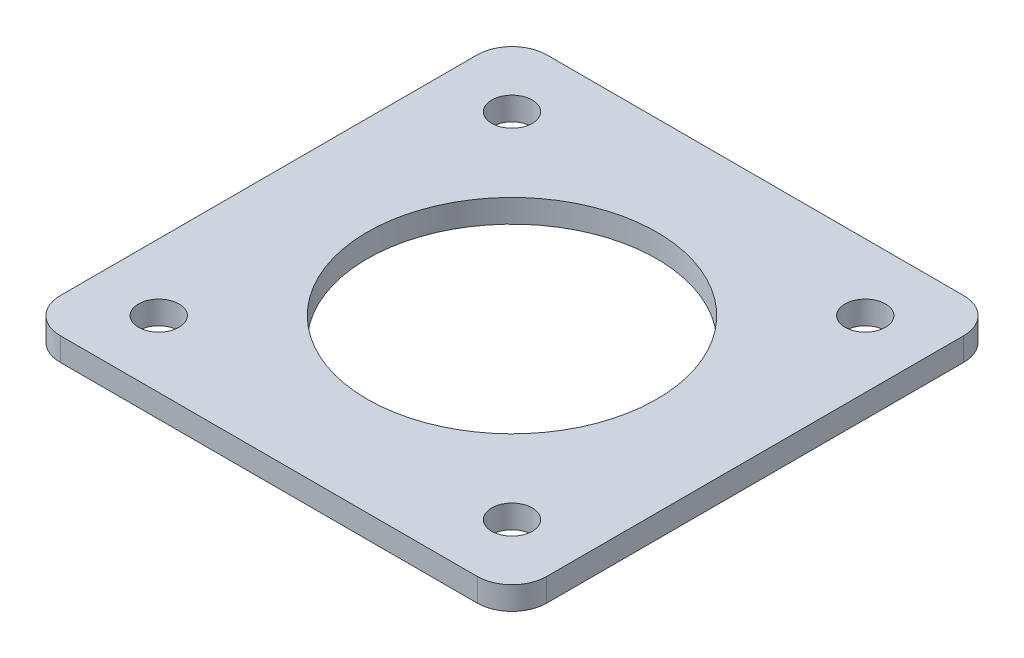
ISO-10303-21;
HEADER;
FILE_DESCRIPTION(('STEP AP214'),'2;1');
FILE_NAME('part.step','',(''),(''),'','','');
FILE_SCHEMA(('AUTOMOTIVE_DESIGN { 1 0 10303 214 1 1 1 1 }'));
ENDSEC;
DATA;
#1=APPLICATION_CONTEXT('core data for automotive mechanical design processes');
#2=APPLICATION_PROTOCOL_DEFINITION('international standard','automotive_design',2000,#1);
#3=PRODUCT_CONTEXT('',#1,'mechanical');
#4=PRODUCT('Part','Part','',(#3));
#5=PRODUCT_RELATED_PRODUCT_CATEGORY('part','',(#4));
#6=PRODUCT_DEFINITION_FORMATION('','',#4);
#7=PRODUCT_DEFINITION_CONTEXT('part definition',#1,'design');
#8=PRODUCT_DEFINITION('design','',#6,#7);
#9=PRODUCT_DEFINITION_SHAPE('','',#8);
#10=(LENGTH_UNIT() NAMED_UNIT(*) SI_UNIT(.MILLI.,.METRE.));
#11=(NAMED_UNIT(*) PLANE_ANGLE_UNIT() SI_UNIT($,.RADIAN.));
#12=(NAMED_UNIT(*) SI_UNIT($,.STERADIAN.) SOLID_ANGLE_UNIT());
#13=UNCERTAINTY_MEASURE_WITH_UNIT(LENGTH_MEASURE(1.E-05),#10,'distance_accuracy_value','');
#14=(GEOMETRIC_REPRESENTATION_CONTEXT(3) GLOBAL_UNCERTAINTY_ASSIGNED_CONTEXT((#13)) GLOBAL_UNIT_ASSIGNED_CONTEXT((#10,
#11,#12)) REPRESENTATION_CONTEXT('',''));
#15=CARTESIAN_POINT('',(0.,0.,0.));
#16=DIRECTION('',(0.,0.,1.));
#17=DIRECTION('',(1.,0.,0.));
#18=AXIS2_PLACEMENT_3D('',#15,#16,#17);
#19=CARTESIAN_POINT('',(3.,2.,-3.));
#20=DIRECTION('',(0.,-1.,0.));
#21=DIRECTION('',(0.,0.,-1.));
#22=AXIS2_PLACEMENT_3D('',#19,#20,#21);
#23=PLANE('',#22);
#24=CARTESIAN_POINT('',(3.,2.,-3.));
#25=DIRECTION('',(0.,1.,0.));
#26=DIRECTION('',(0.,0.,-1.));
#27=AXIS2_PLACEMENT_3D('',#24,#25,#26);
#28=CIRCLE('',#27,3.);
#29=CARTESIAN_POINT('',(0.,2.,-3.00000000000002));
#30=VERTEX_POINT('',#29);
#31=CARTESIAN_POINT('',(3.00000000000002,2.,0.));
#32=VERTEX_POINT('',#31);
#33=EDGE_CURVE('E148',#30,#32,#28,.T.);
#34=ORIENTED_EDGE('',*,*,#33,.T.);
#35=DIRECTION('',(1.,0.,0.));
#36=VECTOR('',#35,1.);
#37=CARTESIAN_POINT('',(3.00000000000002,2.,0.));
#38=LINE('',#37,#36);
#39=CARTESIAN_POINT('',(39.,2.,0.));
#40=VERTEX_POINT('',#39);
#41=EDGE_CURVE('E96',#32,#40,#38,.T.);
#42=ORIENTED_EDGE('',*,*,#41,.T.);
#43=CARTESIAN_POINT('',(39.,2.,-3.));
#44=DIRECTION('',(0.,1.,0.));
#45=DIRECTION('',(0.,0.,1.));
#46=AXIS2_PLACEMENT_3D('',#43,#44,#45);
#47=CIRCLE('',#46,3.);
#48=CARTESIAN_POINT('',(42.,2.,-3.00000000000002));
#49=VERTEX_POINT('',#48);
#50=EDGE_CURVE('E163',#40,#49,#47,.T.);
#51=ORIENTED_EDGE('',*,*,#50,.T.);
#52=DIRECTION('',(0.,0.,-1.));
#53=VECTOR('',#52,1.);
#54=CARTESIAN_POINT('',(42.,2.,-3.00000000000002));
#55=LINE('',#54,#53);
#56=CARTESIAN_POINT('',(42.,2.,-39.));
#57=VERTEX_POINT('',#56);
#58=EDGE_CURVE('E176',#49,#57,#55,.T.);
#59=ORIENTED_EDGE('',*,*,#58,.T.);
#60=CARTESIAN_POINT('',(39.,2.,-39.));
#61=DIRECTION('',(0.,1.,0.));
#62=DIRECTION('',(0.,0.,-1.));
#63=AXIS2_PLACEMENT_3D('',#60,#61,#62);
#64=CIRCLE('',#63,3.);
#65=CARTESIAN_POINT('',(39.,2.,-42.));
#66=VERTEX_POINT('',#65);
#67=EDGE_CURVE('E115',#57,#66,#64,.T.);
#68=ORIENTED_EDGE('',*,*,#67,.T.);
#69=DIRECTION('',(-1.,0.,0.));
#70=VECTOR('',#69,1.);
#71=CARTESIAN_POINT('',(3.00000000000002,2.,-42.));
#72=LINE('',#71,#70);
#73=CARTESIAN_POINT('',(3.00000000000002,2.,-42.));
#74=VERTEX_POINT('',#73);
#75=EDGE_CURVE('E109',#66,#74,#72,.T.);
#76=ORIENTED_EDGE('',*,*,#75,.T.);
#77=CARTESIAN_POINT('',(3.,2.,-39.));
#78=DIRECTION('',(0.,1.,0.));
#79=DIRECTION('',(0.,0.,-1.));
#80=AXIS2_PLACEMENT_3D('',#77,#78,#79);
#81=CIRCLE('',#80,3.);
#82=CARTESIAN_POINT('',(0.,2.,-39.));
#83=VERTEX_POINT('',#82);
#84=EDGE_CURVE('E113',#74,#83,#81,.T.);
#85=ORIENTED_EDGE('',*,*,#84,.T.);
#86=DIRECTION('',(0.,0.,1.));
#87=VECTOR('',#86,1.);
#88=CARTESIAN_POINT('',(0.,2.,-3.00000000000002));
#89=LINE('',#88,#87);
#90=EDGE_CURVE('E53',#83,#30,#89,.T.);
#91=ORIENTED_EDGE('',*,*,#90,.T.);
#92=EDGE_LOOP('',(#34,#42,#51,#59,#68,#76,#85,#91));
#93=FACE_BOUND('',#92,.T.);
#94=CARTESIAN_POINT('',(21.,2.,-21.));
#95=DIRECTION('',(0.,1.,0.));
#96=DIRECTION('',(0.,0.,1.));
#97=AXIS2_PLACEMENT_3D('',#94,#95,#96);
#98=CIRCLE('',#97,12.5);
#99=CARTESIAN_POINT('',(21.,2.,-8.50000000000001));
#100=VERTEX_POINT('',#99);
#101=EDGE_CURVE('E137',#100,#100,#98,.T.);
#102=ORIENTED_EDGE('',*,*,#101,.F.);
#103=EDGE_LOOP('',(#102));
#104=FACE_BOUND('',#103,.T.);
#105=CARTESIAN_POINT('',(5.75,2.,-36.25));
#106=DIRECTION('',(0.,1.,0.));
#107=DIRECTION('',(0.,0.,1.));
#108=AXIS2_PLACEMENT_3D('',#105,#106,#107);
#109=CIRCLE('',#108,1.75);
#110=CARTESIAN_POINT('',(5.75,2.,-34.5));
#111=VERTEX_POINT('',#110);
#112=EDGE_CURVE('E185',#111,#111,#109,.T.);
#113=ORIENTED_EDGE('',*,*,#112,.F.);
#114=EDGE_LOOP('',(#113));
#115=FACE_BOUND('',#114,.T.);
#116=CARTESIAN_POINT('',(36.25,2.,-36.25));
#117=DIRECTION('',(0.,1.,0.));
#118=DIRECTION('',(0.,0.,-1.));
#119=AXIS2_PLACEMENT_3D('',#116,#117,#118);
#120=CIRCLE('',#119,1.75);
#121=CARTESIAN_POINT('',(36.25,2.,-38.));
#122=VERTEX_POINT('',#121);
#123=EDGE_CURVE('E191',#122,#122,#120,.T.);
#124=ORIENTED_EDGE('',*,*,#123,.F.);
#125=EDGE_LOOP('',(#124));
#126=FACE_BOUND('',#125,.T.);
#127=CARTESIAN_POINT('',(36.25,2.,-5.74999999999999));
#128=DIRECTION('',(0.,1.,0.));
#129=DIRECTION('',(0.,0.,1.));
#130=AXIS2_PLACEMENT_3D('',#127,#128,#129);
#131=CIRCLE('',#130,1.75);
#132=CARTESIAN_POINT('',(36.25,2.,-3.99999999999999));
#133=VERTEX_POINT('',#132);
#134=EDGE_CURVE('E197',#133,#133,#131,.T.);
#135=ORIENTED_EDGE('',*,*,#134,.F.);
#136=EDGE_LOOP('',(#135));
#137=FACE_BOUND('',#136,.T.);
#138=CARTESIAN_POINT('',(5.75,2.,-5.75));
#139=DIRECTION('',(0.,1.,0.));
#140=DIRECTION('',(0.,0.,-1.));
#141=AXIS2_PLACEMENT_3D('',#138,#139,#140);
#142=CIRCLE('',#141,1.75);
#143=CARTESIAN_POINT('',(5.75,2.,-7.5));
#144=VERTEX_POINT('',#143);
#145=EDGE_CURVE('E203',#144,#144,#142,.T.);
#146=ORIENTED_EDGE('',*,*,#145,.F.);
#147=EDGE_LOOP('',(#146));
#148=FACE_BOUND('',#147,.T.);
#149=ADVANCED_FACE('F36',(#93,#104,#115,#126,#137,#148),#23,.F.);
#150=CARTESIAN_POINT('',(3.,0.,-3.));
#151=DIRECTION('',(0.,-1.,0.));
#152=DIRECTION('',(0.,0.,-1.));
#153=AXIS2_PLACEMENT_3D('',#150,#151,#152);
#154=PLANE('',#153);
#155=CARTESIAN_POINT('',(36.25,0.,-5.74999999999999));
#156=DIRECTION('',(0.,1.,0.));
#157=DIRECTION('',(0.,0.,1.));
#158=AXIS2_PLACEMENT_3D('',#155,#156,#157);
#159=CIRCLE('',#158,1.75);
#160=CARTESIAN_POINT('',(36.25,0.,-3.99999999999999));
#161=VERTEX_POINT('',#160);
#162=EDGE_CURVE('E200',#161,#161,#159,.T.);
#163=ORIENTED_EDGE('',*,*,#162,.T.);
#164=EDGE_LOOP('',(#163));
#165=FACE_BOUND('',#164,.T.);
#166=CARTESIAN_POINT('',(5.75,0.,-36.25));
#167=DIRECTION('',(0.,1.,0.));
#168=DIRECTION('',(0.,0.,1.));
#169=AXIS2_PLACEMENT_3D('',#166,#167,#168);
#170=CIRCLE('',#169,1.75);
#171=CARTESIAN_POINT('',(5.75,0.,-34.5));
#172=VERTEX_POINT('',#171);
#173=EDGE_CURVE('E188',#172,#172,#170,.T.);
#174=ORIENTED_EDGE('',*,*,#173,.T.);
#175=EDGE_LOOP('',(#174));
#176=FACE_BOUND('',#175,.T.);
#177=CARTESIAN_POINT('',(3.,0.,-3.));
#178=DIRECTION('',(0.,1.,0.));
#179=DIRECTION('',(0.,0.,-1.));
#180=AXIS2_PLACEMENT_3D('',#177,#178,#179);
#181=CIRCLE('',#180,3.);
#182=CARTESIAN_POINT('',(0.,0.,-3.00000000000002));
#183=VERTEX_POINT('',#182);
#184=CARTESIAN_POINT('',(3.00000000000002,0.,0.));
#185=VERTEX_POINT('',#184);
#186=EDGE_CURVE('E133',#183,#185,#181,.T.);
#187=ORIENTED_EDGE('',*,*,#186,.F.);
#188=DIRECTION('',(0.,0.,1.));
#189=VECTOR('',#188,1.);
#190=CARTESIAN_POINT('',(0.,0.,-3.00000000000002));
#191=LINE('',#190,#189);
#192=CARTESIAN_POINT('',(0.,0.,-39.));
#193=VERTEX_POINT('',#192);
#194=EDGE_CURVE('E88',#193,#183,#191,.T.);
#195=ORIENTED_EDGE('',*,*,#194,.F.);
#196=CARTESIAN_POINT('',(3.,0.,-39.));
#197=DIRECTION('',(0.,1.,0.));
#198=DIRECTION('',(0.,0.,-1.));
#199=AXIS2_PLACEMENT_3D('',#196,#197,#198);
#200=CIRCLE('',#199,3.);
#201=CARTESIAN_POINT('',(3.00000000000002,0.,-42.));
#202=VERTEX_POINT('',#201);
#203=EDGE_CURVE('E82',#202,#193,#200,.T.);
#204=ORIENTED_EDGE('',*,*,#203,.F.);
#205=DIRECTION('',(-1.,0.,0.));
#206=VECTOR('',#205,1.);
#207=CARTESIAN_POINT('',(3.00000000000002,0.,-42.));
#208=LINE('',#207,#206);
#209=CARTESIAN_POINT('',(39.,0.,-42.));
#210=VERTEX_POINT('',#209);
#211=EDGE_CURVE('E123',#210,#202,#208,.T.);
#212=ORIENTED_EDGE('',*,*,#211,.F.);
#213=CARTESIAN_POINT('',(39.,0.,-39.));
#214=DIRECTION('',(0.,1.,0.));
#215=DIRECTION('',(0.,0.,-1.));
#216=AXIS2_PLACEMENT_3D('',#213,#214,#215);
#217=CIRCLE('',#216,3.);
#218=CARTESIAN_POINT('',(42.,0.,-39.));
#219=VERTEX_POINT('',#218);
#220=EDGE_CURVE('E143',#219,#210,#217,.T.);
#221=ORIENTED_EDGE('',*,*,#220,.F.);
#222=DIRECTION('',(0.,0.,-1.));
#223=VECTOR('',#222,1.);
#224=CARTESIAN_POINT('',(42.,0.,-3.00000000000002));
#225=LINE('',#224,#223);
#226=CARTESIAN_POINT('',(42.,0.,-3.00000000000002));
#227=VERTEX_POINT('',#226);
#228=EDGE_CURVE('E141',#227,#219,#225,.T.);
#229=ORIENTED_EDGE('',*,*,#228,.F.);
#230=CARTESIAN_POINT('',(39.,0.,-3.));
#231=DIRECTION('',(0.,1.,0.));
#232=DIRECTION('',(0.,0.,1.));
#233=AXIS2_PLACEMENT_3D('',#230,#231,#232);
#234=CIRCLE('',#233,3.);
#235=CARTESIAN_POINT('',(39.,0.,0.));
#236=VERTEX_POINT('',#235);
#237=EDGE_CURVE('E139',#236,#227,#234,.T.);
#238=ORIENTED_EDGE('',*,*,#237,.F.);
#239=DIRECTION('',(1.,0.,0.));
#240=VECTOR('',#239,1.);
#241=CARTESIAN_POINT('',(3.00000000000002,0.,0.));
#242=LINE('',#241,#240);
#243=EDGE_CURVE('E136',#185,#236,#242,.T.);
#244=ORIENTED_EDGE('',*,*,#243,.F.);
#245=EDGE_LOOP('',(#187,#195,#204,#212,#221,#229,#238,#244));
#246=FACE_BOUND('',#245,.T.);
#247=CARTESIAN_POINT('',(21.,0.,-21.));
#248=DIRECTION('',(0.,1.,0.));
#249=DIRECTION('',(0.,0.,1.));
#250=AXIS2_PLACEMENT_3D('',#247,#248,#249);
#251=CIRCLE('',#250,12.5);
#252=CARTESIAN_POINT('',(21.,0.,-8.50000000000001));
#253=VERTEX_POINT('',#252);
#254=EDGE_CURVE('E182',#253,#253,#251,.T.);
#255=ORIENTED_EDGE('',*,*,#254,.T.);
#256=EDGE_LOOP('',(#255));
#257=FACE_BOUND('',#256,.T.);
#258=CARTESIAN_POINT('',(36.25,0.,-36.25));
#259=DIRECTION('',(0.,1.,0.));
#260=DIRECTION('',(0.,0.,-1.));
#261=AXIS2_PLACEMENT_3D('',#258,#259,#260);
#262=CIRCLE('',#261,1.75);
#263=CARTESIAN_POINT('',(36.25,0.,-38.));
#264=VERTEX_POINT('',#263);
#265=EDGE_CURVE('E194',#264,#264,#262,.T.);
#266=ORIENTED_EDGE('',*,*,#265,.T.);
#267=EDGE_LOOP('',(#266));
#268=FACE_BOUND('',#267,.T.);
#269=CARTESIAN_POINT('',(5.75,0.,-5.75));
#270=DIRECTION('',(0.,1.,0.));
#271=DIRECTION('',(0.,0.,-1.));
#272=AXIS2_PLACEMENT_3D('',#269,#270,#271);
#273=CIRCLE('',#272,1.75);
#274=CARTESIAN_POINT('',(5.75,0.,-7.5));
#275=VERTEX_POINT('',#274);
#276=EDGE_CURVE('E206',#275,#275,#273,.T.);
#277=ORIENTED_EDGE('',*,*,#276,.T.);
#278=EDGE_LOOP('',(#277));
#279=FACE_BOUND('',#278,.T.);
#280=ADVANCED_FACE('F167',(#165,#176,#246,#257,#268,#279),#154,.T.);
#281=CARTESIAN_POINT('',(3.,2.,-3.));
#282=DIRECTION('',(0.,-1.,0.));
#283=DIRECTION('',(0.,0.,-1.));
#284=AXIS2_PLACEMENT_3D('',#281,#282,#283);
#285=CYLINDRICAL_SURFACE('',#284,3.);
#286=ORIENTED_EDGE('',*,*,#186,.T.);
#287=DIRECTION('',(0.,-1.,0.));
#288=VECTOR('',#287,1.);
#289=CARTESIAN_POINT('',(3.00000000000002,2.,0.));
#290=LINE('',#289,#288);
#291=EDGE_CURVE('E11',#32,#185,#290,.T.);
#292=ORIENTED_EDGE('',*,*,#291,.F.);
#293=ORIENTED_EDGE('',*,*,#33,.F.);
#294=DIRECTION('',(0.,-1.,0.));
#295=VECTOR('',#294,1.);
#296=CARTESIAN_POINT('',(0.,2.,-3.00000000000002));
#297=LINE('',#296,#295);
#298=EDGE_CURVE('E129',#30,#183,#297,.T.);
#299=ORIENTED_EDGE('',*,*,#298,.T.);
#300=EDGE_LOOP('',(#286,#292,#293,#299));
#301=FACE_BOUND('',#300,.T.);
#302=ADVANCED_FACE('F38',(#301),#285,.T.);
#303=CARTESIAN_POINT('',(3.00000000000002,2.,0.));
#304=DIRECTION('',(0.,0.,-1.));
#305=DIRECTION('',(-1.,0.,0.));
#306=AXIS2_PLACEMENT_3D('',#303,#304,#305);
#307=PLANE('',#306);
#308=ORIENTED_EDGE('',*,*,#243,.T.);
#309=DIRECTION('',(0.,-1.,0.));
#310=VECTOR('',#309,1.);
#311=CARTESIAN_POINT('',(39.,2.,0.));
#312=LINE('',#311,#310);
#313=EDGE_CURVE('E45',#40,#236,#312,.T.);
#314=ORIENTED_EDGE('',*,*,#313,.F.);
#315=ORIENTED_EDGE('',*,*,#41,.F.);
#316=ORIENTED_EDGE('',*,*,#291,.T.);
#317=EDGE_LOOP('',(#308,#314,#315,#316));
#318=FACE_BOUND('',#317,.T.);
#319=ADVANCED_FACE('F238',(#318),#307,.F.);
#320=CARTESIAN_POINT('',(39.,2.,-3.));
#321=DIRECTION('',(0.,-1.,0.));
#322=DIRECTION('',(0.,0.,-1.));
#323=AXIS2_PLACEMENT_3D('',#320,#321,#322);
#324=CYLINDRICAL_SURFACE('',#323,3.);
#325=ORIENTED_EDGE('',*,*,#237,.T.);
#326=DIRECTION('',(0.,-1.,0.));
#327=VECTOR('',#326,1.);
#328=CARTESIAN_POINT('',(42.,2.,-3.00000000000002));
#329=LINE('',#328,#327);
#330=EDGE_CURVE('E155',#49,#227,#329,.T.);
#331=ORIENTED_EDGE('',*,*,#330,.F.);
#332=ORIENTED_EDGE('',*,*,#50,.F.);
#333=ORIENTED_EDGE('',*,*,#313,.T.);
#334=EDGE_LOOP('',(#325,#331,#332,#333));
#335=FACE_BOUND('',#334,.T.);
#336=ADVANCED_FACE('F161',(#335),#324,.T.);
#337=CARTESIAN_POINT('',(42.,2.,-3.00000000000002));
#338=DIRECTION('',(-1.,0.,0.));
#339=DIRECTION('',(0.,0.,1.));
#340=AXIS2_PLACEMENT_3D('',#337,#338,#339);
#341=PLANE('',#340);
#342=ORIENTED_EDGE('',*,*,#228,.T.);
#343=DIRECTION('',(0.,-1.,0.));
#344=VECTOR('',#343,1.);
#345=CARTESIAN_POINT('',(42.,2.,-39.));
#346=LINE('',#345,#344);
#347=EDGE_CURVE('E152',#57,#219,#346,.T.);
#348=ORIENTED_EDGE('',*,*,#347,.F.);
#349=ORIENTED_EDGE('',*,*,#58,.F.);
#350=ORIENTED_EDGE('',*,*,#330,.T.);
#351=EDGE_LOOP('',(#342,#348,#349,#350));
#352=FACE_BOUND('',#351,.T.);
#353=ADVANCED_FACE('F172',(#352),#341,.F.);
#354=CARTESIAN_POINT('',(39.,2.,-39.));
#355=DIRECTION('',(0.,-1.,0.));
#356=DIRECTION('',(0.,0.,-1.));
#357=AXIS2_PLACEMENT_3D('',#354,#355,#356);
#358=CYLINDRICAL_SURFACE('',#357,3.);
#359=ORIENTED_EDGE('',*,*,#220,.T.);
#360=DIRECTION('',(0.,-1.,0.));
#361=VECTOR('',#360,1.);
#362=CARTESIAN_POINT('',(39.,2.,-42.));
#363=LINE('',#362,#361);
#364=EDGE_CURVE('E124',#66,#210,#363,.T.);
#365=ORIENTED_EDGE('',*,*,#364,.F.);
#366=ORIENTED_EDGE('',*,*,#67,.F.);
#367=ORIENTED_EDGE('',*,*,#347,.T.);
#368=EDGE_LOOP('',(#359,#365,#366,#367));
#369=FACE_BOUND('',#368,.T.);
#370=ADVANCED_FACE('F175',(#369),#358,.T.);
#371=CARTESIAN_POINT('',(3.00000000000002,2.,-42.));
#372=DIRECTION('',(0.,0.,1.));
#373=DIRECTION('',(1.,0.,0.));
#374=AXIS2_PLACEMENT_3D('',#371,#372,#373);
#375=PLANE('',#374);
#376=ORIENTED_EDGE('',*,*,#211,.T.);
#377=DIRECTION('',(0.,-1.,0.));
#378=VECTOR('',#377,1.);
#379=CARTESIAN_POINT('',(3.00000000000002,2.,-42.));
#380=LINE('',#379,#378);
#381=EDGE_CURVE('E120',#74,#202,#380,.T.);
#382=ORIENTED_EDGE('',*,*,#381,.F.);
#383=ORIENTED_EDGE('',*,*,#75,.F.);
#384=ORIENTED_EDGE('',*,*,#364,.T.);
#385=EDGE_LOOP('',(#376,#382,#383,#384));
#386=FACE_BOUND('',#385,.T.);
#387=ADVANCED_FACE('F121',(#386),#375,.F.);
#388=CARTESIAN_POINT('',(3.,2.,-39.));
#389=DIRECTION('',(0.,-1.,0.));
#390=DIRECTION('',(0.,0.,-1.));
#391=AXIS2_PLACEMENT_3D('',#388,#389,#390);
#392=CYLINDRICAL_SURFACE('',#391,3.);
#393=ORIENTED_EDGE('',*,*,#203,.T.);
#394=DIRECTION('',(0.,-1.,0.));
#395=VECTOR('',#394,1.);
#396=CARTESIAN_POINT('',(0.,2.,-39.));
#397=LINE('',#396,#395);
#398=EDGE_CURVE('E125',#83,#193,#397,.T.);
#399=ORIENTED_EDGE('',*,*,#398,.F.);
#400=ORIENTED_EDGE('',*,*,#84,.F.);
#401=ORIENTED_EDGE('',*,*,#381,.T.);
#402=EDGE_LOOP('',(#393,#399,#400,#401));
#403=FACE_BOUND('',#402,.T.);
#404=ADVANCED_FACE('F127',(#403),#392,.T.);
#405=CARTESIAN_POINT('',(0.,2.,-3.00000000000002));
#406=DIRECTION('',(1.,0.,0.));
#407=DIRECTION('',(0.,0.,-1.));
#408=AXIS2_PLACEMENT_3D('',#405,#406,#407);
#409=PLANE('',#408);
#410=ORIENTED_EDGE('',*,*,#194,.T.);
#411=ORIENTED_EDGE('',*,*,#298,.F.);
#412=ORIENTED_EDGE('',*,*,#90,.F.);
#413=ORIENTED_EDGE('',*,*,#398,.T.);
#414=EDGE_LOOP('',(#410,#411,#412,#413));
#415=FACE_BOUND('',#414,.T.);
#416=ADVANCED_FACE('F226',(#415),#409,.F.);
#417=CARTESIAN_POINT('',(21.,2.,-21.));
#418=DIRECTION('',(0.,-1.,0.));
#419=DIRECTION('',(0.,0.,-1.));
#420=AXIS2_PLACEMENT_3D('',#417,#418,#419);
#421=CYLINDRICAL_SURFACE('',#420,12.5);
#422=ORIENTED_EDGE('',*,*,#101,.T.);
#423=EDGE_LOOP('',(#422));
#424=FACE_BOUND('',#423,.T.);
#425=ORIENTED_EDGE('',*,*,#254,.F.);
#426=EDGE_LOOP('',(#425));
#427=FACE_BOUND('',#426,.T.);
#428=ADVANCED_FACE('F223',(#424,#427),#421,.F.);
#429=CARTESIAN_POINT('',(5.75,2.,-36.25));
#430=DIRECTION('',(0.,-1.,0.));
#431=DIRECTION('',(0.,0.,-1.));
#432=AXIS2_PLACEMENT_3D('',#429,#430,#431);
#433=CYLINDRICAL_SURFACE('',#432,1.75);
#434=ORIENTED_EDGE('',*,*,#112,.T.);
#435=EDGE_LOOP('',(#434));
#436=FACE_BOUND('',#435,.T.);
#437=ORIENTED_EDGE('',*,*,#173,.F.);
#438=EDGE_LOOP('',(#437));
#439=FACE_BOUND('',#438,.T.);
#440=ADVANCED_FACE('F302',(#436,#439),#433,.F.);
#441=CARTESIAN_POINT('',(36.25,2.,-36.25));
#442=DIRECTION('',(0.,-1.,0.));
#443=DIRECTION('',(0.,0.,-1.));
#444=AXIS2_PLACEMENT_3D('',#441,#442,#443);
#445=CYLINDRICAL_SURFACE('',#444,1.75);
#446=ORIENTED_EDGE('',*,*,#123,.T.);
#447=EDGE_LOOP('',(#446));
#448=FACE_BOUND('',#447,.T.);
#449=ORIENTED_EDGE('',*,*,#265,.F.);
#450=EDGE_LOOP('',(#449));
#451=FACE_BOUND('',#450,.T.);
#452=ADVANCED_FACE('F310',(#448,#451),#445,.F.);
#453=CARTESIAN_POINT('',(36.25,2.,-5.74999999999999));
#454=DIRECTION('',(0.,-1.,0.));
#455=DIRECTION('',(0.,0.,-1.));
#456=AXIS2_PLACEMENT_3D('',#453,#454,#455);
#457=CYLINDRICAL_SURFACE('',#456,1.75);
#458=ORIENTED_EDGE('',*,*,#134,.T.);
#459=EDGE_LOOP('',(#458));
#460=FACE_BOUND('',#459,.T.);
#461=ORIENTED_EDGE('',*,*,#162,.F.);
#462=EDGE_LOOP('',(#461));
#463=FACE_BOUND('',#462,.T.);
#464=ADVANCED_FACE('F318',(#460,#463),#457,.F.);
#465=CARTESIAN_POINT('',(5.75,2.,-5.75));
#466=DIRECTION('',(0.,-1.,0.));
#467=DIRECTION('',(0.,0.,-1.));
#468=AXIS2_PLACEMENT_3D('',#465,#466,#467);
#469=CYLINDRICAL_SURFACE('',#468,1.75);
#470=ORIENTED_EDGE('',*,*,#145,.T.);
#471=EDGE_LOOP('',(#470));
#472=FACE_BOUND('',#471,.T.);
#473=ORIENTED_EDGE('',*,*,#276,.F.);
#474=EDGE_LOOP('',(#473));
#475=FACE_BOUND('',#474,.T.);
#476=ADVANCED_FACE('F212',(#472,#475),#469,.F.);
#477=CLOSED_SHELL('',(#149,#280,#302,#319,#336,#353,#370,#387,#404,#416,#428,#440,#452,#464,#476));
#478=MANIFOLD_SOLID_BREP('B2',#477);
#479=ADVANCED_BREP_SHAPE_REPRESENTATION('',(#18,#478),#14);
#480=SHAPE_DEFINITION_REPRESENTATION(#9,#479);
ENDSEC;
END-ISO-10303-21;
